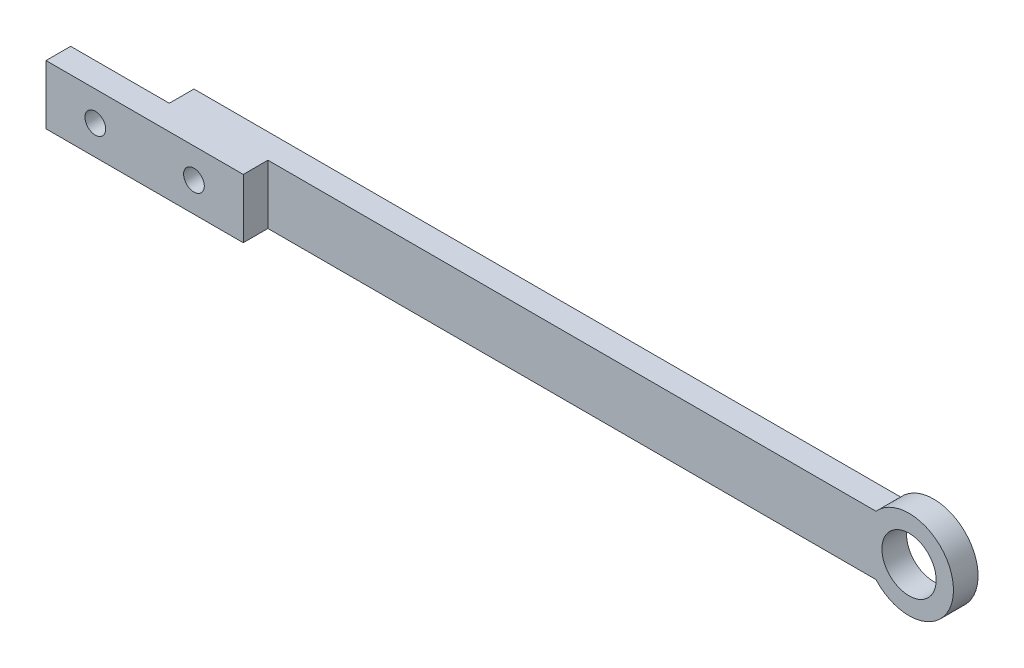
ISO-10303-21;
HEADER;
FILE_DESCRIPTION(('STEP AP214'),'2;1');
FILE_NAME('part.step','',(''),(''),'','','');
FILE_SCHEMA(('AUTOMOTIVE_DESIGN { 1 0 10303 214 1 1 1 1 }'));
ENDSEC;
DATA;
#1=APPLICATION_CONTEXT('core data for automotive mechanical design processes');
#2=APPLICATION_PROTOCOL_DEFINITION('international standard','automotive_design',2000,#1);
#3=PRODUCT_CONTEXT('',#1,'mechanical');
#4=PRODUCT('Part','Part','',(#3));
#5=PRODUCT_RELATED_PRODUCT_CATEGORY('part','',(#4));
#6=PRODUCT_DEFINITION_FORMATION('','',#4);
#7=PRODUCT_DEFINITION_CONTEXT('part definition',#1,'design');
#8=PRODUCT_DEFINITION('design','',#6,#7);
#9=PRODUCT_DEFINITION_SHAPE('','',#8);
#10=(LENGTH_UNIT() NAMED_UNIT(*) SI_UNIT(.MILLI.,.METRE.));
#11=(NAMED_UNIT(*) PLANE_ANGLE_UNIT() SI_UNIT($,.RADIAN.));
#12=(NAMED_UNIT(*) SI_UNIT($,.STERADIAN.) SOLID_ANGLE_UNIT());
#13=UNCERTAINTY_MEASURE_WITH_UNIT(LENGTH_MEASURE(1.E-05),#10,'distance_accuracy_value','');
#14=(GEOMETRIC_REPRESENTATION_CONTEXT(3) GLOBAL_UNCERTAINTY_ASSIGNED_CONTEXT((#13)) GLOBAL_UNIT_ASSIGNED_CONTEXT((#10,
#11,#12)) REPRESENTATION_CONTEXT('',''));
#15=CARTESIAN_POINT('',(0.,0.,0.));
#16=DIRECTION('',(0.,0.,1.));
#17=DIRECTION('',(1.,0.,0.));
#18=AXIS2_PLACEMENT_3D('',#15,#16,#17);
#19=CARTESIAN_POINT('',(-150.,5.99999999999998,5.));
#20=DIRECTION('',(1.,0.,0.));
#21=DIRECTION('',(0.,0.,-1.));
#22=AXIS2_PLACEMENT_3D('',#19,#20,#21);
#23=PLANE('',#22);
#24=DIRECTION('',(0.,-1.,0.));
#25=VECTOR('',#24,1.);
#26=CARTESIAN_POINT('',(-150.,5.99999999999998,0.));
#27=LINE('',#26,#25);
#28=CARTESIAN_POINT('',(-150.,5.99999999999998,0.));
#29=VERTEX_POINT('',#28);
#30=CARTESIAN_POINT('',(-150.,-5.99999999999998,0.));
#31=VERTEX_POINT('',#30);
#32=EDGE_CURVE('E155',#29,#31,#27,.T.);
#33=ORIENTED_EDGE('',*,*,#32,.T.);
#34=DIRECTION('',(0.,0.,-1.));
#35=VECTOR('',#34,1.);
#36=CARTESIAN_POINT('',(-150.,-5.99999999999998,5.));
#37=LINE('',#36,#35);
#38=CARTESIAN_POINT('',(-150.,-5.99999999999998,5.));
#39=VERTEX_POINT('',#38);
#40=EDGE_CURVE('E11',#39,#31,#37,.T.);
#41=ORIENTED_EDGE('',*,*,#40,.F.);
#42=DIRECTION('',(0.,-1.,0.));
#43=VECTOR('',#42,1.);
#44=CARTESIAN_POINT('',(-150.,5.99999999999998,5.));
#45=LINE('',#44,#43);
#46=CARTESIAN_POINT('',(-150.,5.99999999999998,5.));
#47=VERTEX_POINT('',#46);
#48=EDGE_CURVE('E157',#47,#39,#45,.T.);
#49=ORIENTED_EDGE('',*,*,#48,.F.);
#50=DIRECTION('',(0.,0.,-1.));
#51=VECTOR('',#50,1.);
#52=CARTESIAN_POINT('',(-150.,5.99999999999998,5.));
#53=LINE('',#52,#51);
#54=EDGE_CURVE('E70',#47,#29,#53,.T.);
#55=ORIENTED_EDGE('',*,*,#54,.T.);
#56=EDGE_LOOP('',(#33,#41,#49,#55));
#57=FACE_BOUND('',#56,.T.);
#58=ADVANCED_FACE('F45',(#57),#23,.F.);
#59=CARTESIAN_POINT('',(-150.,-5.99999999999998,5.));
#60=DIRECTION('',(0.,1.,0.));
#61=DIRECTION('',(-1.,0.,0.));
#62=AXIS2_PLACEMENT_3D('',#59,#60,#61);
#63=PLANE('',#62);
#64=DIRECTION('',(1.,0.,0.));
#65=VECTOR('',#64,1.);
#66=CARTESIAN_POINT('',(-150.,-5.99999999999998,0.));
#67=LINE('',#66,#65);
#68=CARTESIAN_POINT('',(-6.70820393249937,-5.99999999999999,0.));
#69=VERTEX_POINT('',#68);
#70=EDGE_CURVE('E171',#31,#69,#67,.T.);
#71=ORIENTED_EDGE('',*,*,#70,.T.);
#72=DIRECTION('',(0.,0.,-1.));
#73=VECTOR('',#72,1.);
#74=CARTESIAN_POINT('',(-6.70820393249937,-5.99999999999999,5.));
#75=LINE('',#74,#73);
#76=CARTESIAN_POINT('',(-6.70820393249937,-5.99999999999999,5.));
#77=VERTEX_POINT('',#76);
#78=EDGE_CURVE('E54',#77,#69,#75,.T.);
#79=ORIENTED_EDGE('',*,*,#78,.F.);
#80=DIRECTION('',(1.,0.,0.));
#81=VECTOR('',#80,1.);
#82=CARTESIAN_POINT('',(-150.,-5.99999999999998,5.));
#83=LINE('',#82,#81);
#84=CARTESIAN_POINT('',(-130.,-5.99999999999998,5.));
#85=VERTEX_POINT('',#84);
#86=EDGE_CURVE('E160',#85,#77,#83,.T.);
#87=ORIENTED_EDGE('',*,*,#86,.F.);
#88=DIRECTION('',(0.,0.,-1.));
#89=VECTOR('',#88,1.);
#90=CARTESIAN_POINT('',(-130.,-5.99999999999998,10.));
#91=LINE('',#90,#89);
#92=CARTESIAN_POINT('',(-130.,-5.99999999999998,10.));
#93=VERTEX_POINT('',#92);
#94=EDGE_CURVE('E214',#93,#85,#91,.T.);
#95=ORIENTED_EDGE('',*,*,#94,.F.);
#96=DIRECTION('',(1.,0.,0.));
#97=VECTOR('',#96,1.);
#98=CARTESIAN_POINT('',(-130.,-5.99999999999998,10.));
#99=LINE('',#98,#97);
#100=CARTESIAN_POINT('',(-170.,-5.99999999999998,10.));
#101=VERTEX_POINT('',#100);
#102=EDGE_CURVE('E133',#101,#93,#99,.T.);
#103=ORIENTED_EDGE('',*,*,#102,.F.);
#104=DIRECTION('',(0.,0.,-1.));
#105=VECTOR('',#104,1.);
#106=CARTESIAN_POINT('',(-170.,-5.99999999999998,10.));
#107=LINE('',#106,#105);
#108=CARTESIAN_POINT('',(-170.,-5.99999999999998,5.));
#109=VERTEX_POINT('',#108);
#110=EDGE_CURVE('E149',#101,#109,#107,.T.);
#111=ORIENTED_EDGE('',*,*,#110,.T.);
#112=DIRECTION('',(1.,0.,0.));
#113=VECTOR('',#112,1.);
#114=CARTESIAN_POINT('',(-130.,-5.99999999999998,5.));
#115=LINE('',#114,#113);
#116=EDGE_CURVE('E138',#109,#39,#115,.T.);
#117=ORIENTED_EDGE('',*,*,#116,.T.);
#118=ORIENTED_EDGE('',*,*,#40,.T.);
#119=EDGE_LOOP('',(#71,#79,#87,#95,#103,#111,#117,#118));
#120=FACE_BOUND('',#119,.T.);
#121=ADVANCED_FACE('F219',(#120),#63,.F.);
#122=CARTESIAN_POINT('',(0.,0.,5.));
#123=DIRECTION('',(0.,0.,-1.));
#124=DIRECTION('',(-1.,0.,0.));
#125=AXIS2_PLACEMENT_3D('',#122,#123,#124);
#126=CYLINDRICAL_SURFACE('',#125,9.);
#127=CARTESIAN_POINT('',(0.,0.,0.));
#128=DIRECTION('',(0.,0.,1.));
#129=DIRECTION('',(1.,0.,0.));
#130=AXIS2_PLACEMENT_3D('',#127,#128,#129);
#131=CIRCLE('',#130,9.);
#132=CARTESIAN_POINT('',(-6.70820393249937,6.,0.));
#133=VERTEX_POINT('',#132);
#134=EDGE_CURVE('E174',#69,#133,#131,.T.);
#135=ORIENTED_EDGE('',*,*,#134,.T.);
#136=DIRECTION('',(0.,0.,-1.));
#137=VECTOR('',#136,1.);
#138=CARTESIAN_POINT('',(-6.70820393249937,6.,5.));
#139=LINE('',#138,#137);
#140=CARTESIAN_POINT('',(-6.70820393249937,6.,5.));
#141=VERTEX_POINT('',#140);
#142=EDGE_CURVE('E181',#141,#133,#139,.T.);
#143=ORIENTED_EDGE('',*,*,#142,.F.);
#144=CARTESIAN_POINT('',(0.,0.,5.));
#145=DIRECTION('',(0.,0.,1.));
#146=DIRECTION('',(1.,0.,0.));
#147=AXIS2_PLACEMENT_3D('',#144,#145,#146);
#148=CIRCLE('',#147,9.);
#149=EDGE_CURVE('E163',#77,#141,#148,.T.);
#150=ORIENTED_EDGE('',*,*,#149,.F.);
#151=ORIENTED_EDGE('',*,*,#78,.T.);
#152=EDGE_LOOP('',(#135,#143,#150,#151));
#153=FACE_BOUND('',#152,.T.);
#154=ADVANCED_FACE('F190',(#153),#126,.T.);
#155=CARTESIAN_POINT('',(-6.70820393249937,6.,5.));
#156=DIRECTION('',(0.,-1.,0.));
#157=DIRECTION('',(1.,0.,0.));
#158=AXIS2_PLACEMENT_3D('',#155,#156,#157);
#159=PLANE('',#158);
#160=DIRECTION('',(-1.,0.,0.));
#161=VECTOR('',#160,1.);
#162=CARTESIAN_POINT('',(-6.70820393249937,6.,0.));
#163=LINE('',#162,#161);
#164=EDGE_CURVE('E90',#133,#29,#163,.T.);
#165=ORIENTED_EDGE('',*,*,#164,.T.);
#166=ORIENTED_EDGE('',*,*,#54,.F.);
#167=DIRECTION('',(-1.,0.,0.));
#168=VECTOR('',#167,1.);
#169=CARTESIAN_POINT('',(-130.,6.,5.));
#170=LINE('',#169,#168);
#171=CARTESIAN_POINT('',(-170.,5.99999999999999,5.));
#172=VERTEX_POINT('',#171);
#173=EDGE_CURVE('E201',#47,#172,#170,.T.);
#174=ORIENTED_EDGE('',*,*,#173,.T.);
#175=DIRECTION('',(0.,0.,-1.));
#176=VECTOR('',#175,1.);
#177=CARTESIAN_POINT('',(-170.,5.99999999999999,10.));
#178=LINE('',#177,#176);
#179=CARTESIAN_POINT('',(-170.,5.99999999999999,10.));
#180=VERTEX_POINT('',#179);
#181=EDGE_CURVE('E123',#180,#172,#178,.T.);
#182=ORIENTED_EDGE('',*,*,#181,.F.);
#183=DIRECTION('',(-1.,0.,0.));
#184=VECTOR('',#183,1.);
#185=CARTESIAN_POINT('',(-130.,6.,10.));
#186=LINE('',#185,#184);
#187=CARTESIAN_POINT('',(-130.,6.,10.));
#188=VERTEX_POINT('',#187);
#189=EDGE_CURVE('E116',#188,#180,#186,.T.);
#190=ORIENTED_EDGE('',*,*,#189,.F.);
#191=DIRECTION('',(0.,0.,-1.));
#192=VECTOR('',#191,1.);
#193=CARTESIAN_POINT('',(-130.,6.,10.));
#194=LINE('',#193,#192);
#195=CARTESIAN_POINT('',(-130.,6.,5.));
#196=VERTEX_POINT('',#195);
#197=EDGE_CURVE('E121',#188,#196,#194,.T.);
#198=ORIENTED_EDGE('',*,*,#197,.T.);
#199=DIRECTION('',(-1.,0.,0.));
#200=VECTOR('',#199,1.);
#201=CARTESIAN_POINT('',(-6.70820393249937,6.,5.));
#202=LINE('',#201,#200);
#203=EDGE_CURVE('E166',#141,#196,#202,.T.);
#204=ORIENTED_EDGE('',*,*,#203,.F.);
#205=ORIENTED_EDGE('',*,*,#142,.T.);
#206=EDGE_LOOP('',(#165,#166,#174,#182,#190,#198,#204,#205));
#207=FACE_BOUND('',#206,.T.);
#208=ADVANCED_FACE('F118',(#207),#159,.F.);
#209=CARTESIAN_POINT('',(0.,0.,5.));
#210=DIRECTION('',(0.,0.,1.));
#211=DIRECTION('',(1.,0.,0.));
#212=AXIS2_PLACEMENT_3D('',#209,#210,#211);
#213=PLANE('',#212);
#214=DIRECTION('',(0.,1.,0.));
#215=VECTOR('',#214,1.);
#216=CARTESIAN_POINT('',(-130.,6.,5.));
#217=LINE('',#216,#215);
#218=EDGE_CURVE('E61',#85,#196,#217,.T.);
#219=ORIENTED_EDGE('',*,*,#218,.F.);
#220=ORIENTED_EDGE('',*,*,#86,.T.);
#221=ORIENTED_EDGE('',*,*,#149,.T.);
#222=ORIENTED_EDGE('',*,*,#203,.T.);
#223=EDGE_LOOP('',(#219,#220,#221,#222));
#224=FACE_BOUND('',#223,.T.);
#225=CARTESIAN_POINT('',(0.,0.,5.));
#226=DIRECTION('',(0.,0.,1.));
#227=DIRECTION('',(1.,0.,0.));
#228=AXIS2_PLACEMENT_3D('',#225,#226,#227);
#229=CIRCLE('',#228,5.5);
#230=CARTESIAN_POINT('',(5.5,0.,5.));
#231=VERTEX_POINT('',#230);
#232=EDGE_CURVE('E142',#231,#231,#229,.T.);
#233=ORIENTED_EDGE('',*,*,#232,.F.);
#234=EDGE_LOOP('',(#233));
#235=FACE_BOUND('',#234,.T.);
#236=ADVANCED_FACE('F268',(#224,#235),#213,.T.);
#237=CARTESIAN_POINT('',(0.,0.,0.));
#238=DIRECTION('',(0.,0.,1.));
#239=DIRECTION('',(1.,0.,0.));
#240=AXIS2_PLACEMENT_3D('',#237,#238,#239);
#241=PLANE('',#240);
#242=CARTESIAN_POINT('',(-140.,0.,0.));
#243=DIRECTION('',(0.,0.,1.));
#244=DIRECTION('',(1.,0.,0.));
#245=AXIS2_PLACEMENT_3D('',#242,#243,#244);
#246=CIRCLE('',#245,2.09999999999999);
#247=CARTESIAN_POINT('',(-137.9,0.,0.));
#248=VERTEX_POINT('',#247);
#249=EDGE_CURVE('E226',#248,#248,#246,.T.);
#250=ORIENTED_EDGE('',*,*,#249,.T.);
#251=EDGE_LOOP('',(#250));
#252=FACE_BOUND('',#251,.T.);
#253=CARTESIAN_POINT('',(0.,0.,0.));
#254=DIRECTION('',(0.,0.,1.));
#255=DIRECTION('',(1.,0.,0.));
#256=AXIS2_PLACEMENT_3D('',#253,#254,#255);
#257=CIRCLE('',#256,5.5);
#258=CARTESIAN_POINT('',(5.5,0.,0.));
#259=VERTEX_POINT('',#258);
#260=EDGE_CURVE('E147',#259,#259,#257,.T.);
#261=ORIENTED_EDGE('',*,*,#260,.T.);
#262=EDGE_LOOP('',(#261));
#263=FACE_BOUND('',#262,.T.);
#264=ORIENTED_EDGE('',*,*,#32,.F.);
#265=ORIENTED_EDGE('',*,*,#164,.F.);
#266=ORIENTED_EDGE('',*,*,#134,.F.);
#267=ORIENTED_EDGE('',*,*,#70,.F.);
#268=EDGE_LOOP('',(#264,#265,#266,#267));
#269=FACE_BOUND('',#268,.T.);
#270=ADVANCED_FACE('F195',(#252,#263,#269),#241,.F.);
#271=CARTESIAN_POINT('',(0.,0.,0.));
#272=DIRECTION('',(0.,0.,1.));
#273=DIRECTION('',(1.,0.,0.));
#274=AXIS2_PLACEMENT_3D('',#271,#272,#273);
#275=CYLINDRICAL_SURFACE('',#274,5.5);
#276=ORIENTED_EDGE('',*,*,#260,.F.);
#277=EDGE_LOOP('',(#276));
#278=FACE_BOUND('',#277,.T.);
#279=ORIENTED_EDGE('',*,*,#232,.T.);
#280=EDGE_LOOP('',(#279));
#281=FACE_BOUND('',#280,.T.);
#282=ADVANCED_FACE('F271',(#278,#281),#275,.F.);
#283=CARTESIAN_POINT('',(-130.,6.,10.));
#284=DIRECTION('',(-1.,0.,0.));
#285=DIRECTION('',(0.,0.,1.));
#286=AXIS2_PLACEMENT_3D('',#283,#284,#285);
#287=PLANE('',#286);
#288=ORIENTED_EDGE('',*,*,#218,.T.);
#289=ORIENTED_EDGE('',*,*,#197,.F.);
#290=DIRECTION('',(0.,1.,0.));
#291=VECTOR('',#290,1.);
#292=CARTESIAN_POINT('',(-130.,6.,10.));
#293=LINE('',#292,#291);
#294=EDGE_CURVE('E128',#93,#188,#293,.T.);
#295=ORIENTED_EDGE('',*,*,#294,.F.);
#296=ORIENTED_EDGE('',*,*,#94,.T.);
#297=EDGE_LOOP('',(#288,#289,#295,#296));
#298=FACE_BOUND('',#297,.T.);
#299=ADVANCED_FACE('F140',(#298),#287,.F.);
#300=CARTESIAN_POINT('',(-170.,5.99999999999999,10.));
#301=DIRECTION('',(1.,0.,0.));
#302=DIRECTION('',(0.,0.,-1.));
#303=AXIS2_PLACEMENT_3D('',#300,#301,#302);
#304=PLANE('',#303);
#305=DIRECTION('',(0.,-1.,0.));
#306=VECTOR('',#305,1.);
#307=CARTESIAN_POINT('',(-170.,5.99999999999999,5.));
#308=LINE('',#307,#306);
#309=EDGE_CURVE('E203',#172,#109,#308,.T.);
#310=ORIENTED_EDGE('',*,*,#309,.T.);
#311=ORIENTED_EDGE('',*,*,#110,.F.);
#312=DIRECTION('',(0.,-1.,0.));
#313=VECTOR('',#312,1.);
#314=CARTESIAN_POINT('',(-170.,5.99999999999999,10.));
#315=LINE('',#314,#313);
#316=EDGE_CURVE('E127',#180,#101,#315,.T.);
#317=ORIENTED_EDGE('',*,*,#316,.F.);
#318=ORIENTED_EDGE('',*,*,#181,.T.);
#319=EDGE_LOOP('',(#310,#311,#317,#318));
#320=FACE_BOUND('',#319,.T.);
#321=ADVANCED_FACE('F221',(#320),#304,.F.);
#322=CARTESIAN_POINT('',(0.,0.,10.));
#323=DIRECTION('',(0.,0.,-1.));
#324=DIRECTION('',(-1.,0.,0.));
#325=AXIS2_PLACEMENT_3D('',#322,#323,#324);
#326=PLANE('',#325);
#327=CARTESIAN_POINT('',(-160.,0.,10.));
#328=DIRECTION('',(0.,0.,1.));
#329=DIRECTION('',(1.,0.,0.));
#330=AXIS2_PLACEMENT_3D('',#327,#328,#329);
#331=CIRCLE('',#330,2.09999999999999);
#332=CARTESIAN_POINT('',(-157.9,0.,10.));
#333=VERTEX_POINT('',#332);
#334=EDGE_CURVE('E234',#333,#333,#331,.T.);
#335=ORIENTED_EDGE('',*,*,#334,.F.);
#336=EDGE_LOOP('',(#335));
#337=FACE_BOUND('',#336,.T.);
#338=CARTESIAN_POINT('',(-140.,0.,10.));
#339=DIRECTION('',(0.,0.,1.));
#340=DIRECTION('',(1.,0.,0.));
#341=AXIS2_PLACEMENT_3D('',#338,#339,#340);
#342=CIRCLE('',#341,2.09999999999999);
#343=CARTESIAN_POINT('',(-137.9,0.,10.));
#344=VERTEX_POINT('',#343);
#345=EDGE_CURVE('E230',#344,#344,#342,.T.);
#346=ORIENTED_EDGE('',*,*,#345,.F.);
#347=EDGE_LOOP('',(#346));
#348=FACE_BOUND('',#347,.T.);
#349=ORIENTED_EDGE('',*,*,#294,.T.);
#350=ORIENTED_EDGE('',*,*,#189,.T.);
#351=ORIENTED_EDGE('',*,*,#316,.T.);
#352=ORIENTED_EDGE('',*,*,#102,.T.);
#353=EDGE_LOOP('',(#349,#350,#351,#352));
#354=FACE_BOUND('',#353,.T.);
#355=ADVANCED_FACE('F131',(#337,#348,#354),#326,.F.);
#356=CARTESIAN_POINT('',(0.,0.,5.));
#357=DIRECTION('',(0.,0.,-1.));
#358=DIRECTION('',(-1.,0.,0.));
#359=AXIS2_PLACEMENT_3D('',#356,#357,#358);
#360=PLANE('',#359);
#361=CARTESIAN_POINT('',(-160.,0.,5.));
#362=DIRECTION('',(0.,0.,-1.));
#363=DIRECTION('',(-1.,0.,0.));
#364=AXIS2_PLACEMENT_3D('',#361,#362,#363);
#365=CIRCLE('',#364,2.09999999999999);
#366=CARTESIAN_POINT('',(-162.1,0.,5.));
#367=VERTEX_POINT('',#366);
#368=EDGE_CURVE('E48',#367,#367,#365,.T.);
#369=ORIENTED_EDGE('',*,*,#368,.F.);
#370=EDGE_LOOP('',(#369));
#371=FACE_BOUND('',#370,.T.);
#372=ORIENTED_EDGE('',*,*,#173,.F.);
#373=ORIENTED_EDGE('',*,*,#48,.T.);
#374=ORIENTED_EDGE('',*,*,#116,.F.);
#375=ORIENTED_EDGE('',*,*,#309,.F.);
#376=EDGE_LOOP('',(#372,#373,#374,#375));
#377=FACE_BOUND('',#376,.T.);
#378=ADVANCED_FACE('F202',(#371,#377),#360,.T.);
#379=CARTESIAN_POINT('',(-160.,0.,0.));
#380=DIRECTION('',(0.,0.,1.));
#381=DIRECTION('',(1.,0.,0.));
#382=AXIS2_PLACEMENT_3D('',#379,#380,#381);
#383=CYLINDRICAL_SURFACE('',#382,2.09999999999999);
#384=ORIENTED_EDGE('',*,*,#368,.T.);
#385=EDGE_LOOP('',(#384));
#386=FACE_BOUND('',#385,.T.);
#387=ORIENTED_EDGE('',*,*,#334,.T.);
#388=EDGE_LOOP('',(#387));
#389=FACE_BOUND('',#388,.T.);
#390=ADVANCED_FACE('F243',(#386,#389),#383,.F.);
#391=CARTESIAN_POINT('',(-140.,0.,0.));
#392=DIRECTION('',(0.,0.,1.));
#393=DIRECTION('',(1.,0.,0.));
#394=AXIS2_PLACEMENT_3D('',#391,#392,#393);
#395=CYLINDRICAL_SURFACE('',#394,2.09999999999999);
#396=ORIENTED_EDGE('',*,*,#249,.F.);
#397=EDGE_LOOP('',(#396));
#398=FACE_BOUND('',#397,.T.);
#399=ORIENTED_EDGE('',*,*,#345,.T.);
#400=EDGE_LOOP('',(#399));
#401=FACE_BOUND('',#400,.T.);
#402=ADVANCED_FACE('F251',(#398,#401),#395,.F.);
#403=CLOSED_SHELL('',(#58,#121,#154,#208,#236,#270,#282,#299,#321,#355,#378,#390,#402));
#404=MANIFOLD_SOLID_BREP('B2',#403);
#405=ADVANCED_BREP_SHAPE_REPRESENTATION('',(#18,#404),#14);
#406=SHAPE_DEFINITION_REPRESENTATION(#9,#405);
ENDSEC;
END-ISO-10303-21;
